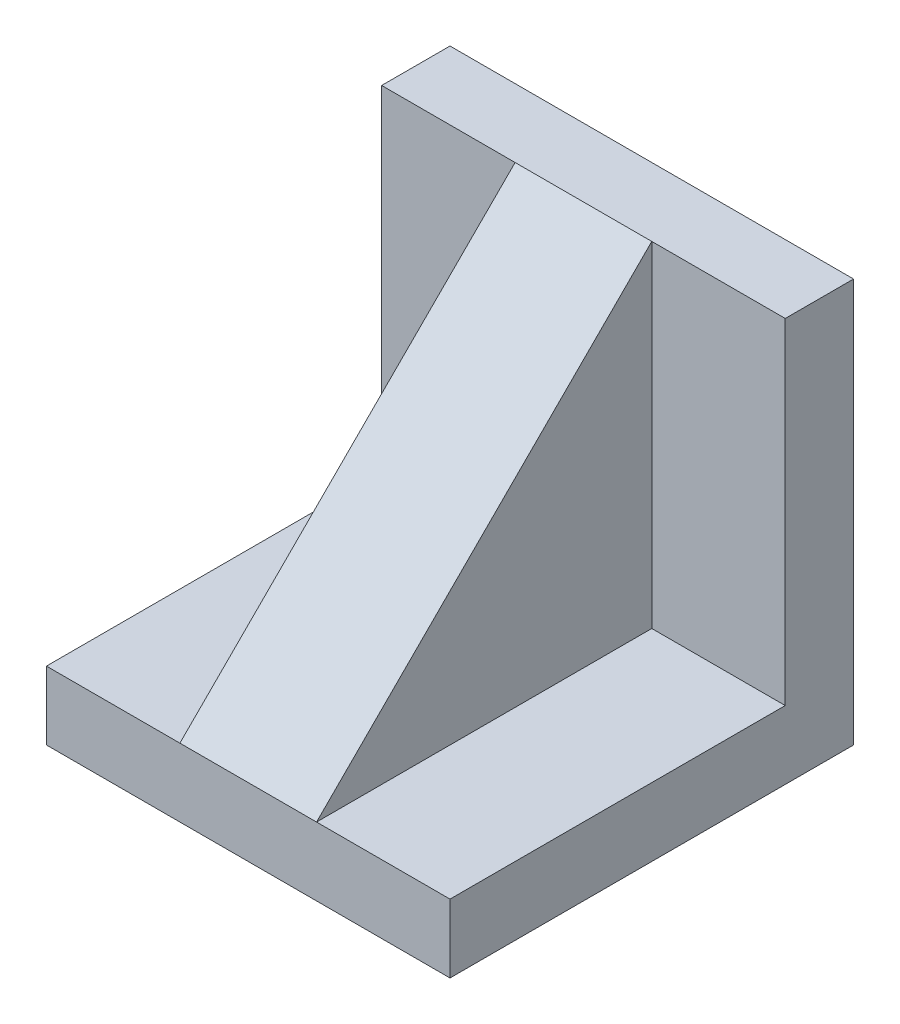
ISO-10303-21;
HEADER;
FILE_DESCRIPTION(('STEP AP214'),'2;1');
FILE_NAME('part.step','',(''),(''),'','','');
FILE_SCHEMA(('AUTOMOTIVE_DESIGN { 1 0 10303 214 1 1 1 1 }'));
ENDSEC;
DATA;
#1=APPLICATION_CONTEXT('core data for automotive mechanical design processes');
#2=APPLICATION_PROTOCOL_DEFINITION('international standard','automotive_design',2000,#1);
#3=PRODUCT_CONTEXT('',#1,'mechanical');
#4=PRODUCT('Part','Part','',(#3));
#5=PRODUCT_RELATED_PRODUCT_CATEGORY('part','',(#4));
#6=PRODUCT_DEFINITION_FORMATION('','',#4);
#7=PRODUCT_DEFINITION_CONTEXT('part definition',#1,'design');
#8=PRODUCT_DEFINITION('design','',#6,#7);
#9=PRODUCT_DEFINITION_SHAPE('','',#8);
#10=(LENGTH_UNIT() NAMED_UNIT(*) SI_UNIT(.MILLI.,.METRE.));
#11=(NAMED_UNIT(*) PLANE_ANGLE_UNIT() SI_UNIT($,.RADIAN.));
#12=(NAMED_UNIT(*) SI_UNIT($,.STERADIAN.) SOLID_ANGLE_UNIT());
#13=UNCERTAINTY_MEASURE_WITH_UNIT(LENGTH_MEASURE(1.E-05),#10,'distance_accuracy_value','');
#14=(GEOMETRIC_REPRESENTATION_CONTEXT(3) GLOBAL_UNCERTAINTY_ASSIGNED_CONTEXT((#13)) GLOBAL_UNIT_ASSIGNED_CONTEXT((#10,
#11,#12)) REPRESENTATION_CONTEXT('',''));
#15=CARTESIAN_POINT('',(0.,0.,0.));
#16=DIRECTION('',(0.,0.,1.));
#17=DIRECTION('',(1.,0.,0.));
#18=AXIS2_PLACEMENT_3D('',#15,#16,#17);
#19=CARTESIAN_POINT('',(-75.,25.4,150.));
#20=DIRECTION('',(0.,-1.,0.));
#21=DIRECTION('',(0.,0.,-1.));
#22=AXIS2_PLACEMENT_3D('',#19,#20,#21);
#23=PLANE('',#22);
#24=DIRECTION('',(0.,0.,-1.));
#25=VECTOR('',#24,1.);
#26=CARTESIAN_POINT('',(25.4,25.4,150.));
#27=LINE('',#26,#25);
#28=CARTESIAN_POINT('',(25.4,25.4,150.));
#29=VERTEX_POINT('',#28);
#30=CARTESIAN_POINT('',(25.4,25.4,25.4));
#31=VERTEX_POINT('',#30);
#32=EDGE_CURVE('E138',#29,#31,#27,.T.);
#33=ORIENTED_EDGE('',*,*,#32,.F.);
#34=DIRECTION('',(1.,0.,0.));
#35=VECTOR('',#34,1.);
#36=CARTESIAN_POINT('',(-75.,25.4,150.));
#37=LINE('',#36,#35);
#38=CARTESIAN_POINT('',(75.,25.4,150.));
#39=VERTEX_POINT('',#38);
#40=EDGE_CURVE('E60',#29,#39,#37,.T.);
#41=ORIENTED_EDGE('',*,*,#40,.T.);
#42=DIRECTION('',(0.,0.,-1.));
#43=VECTOR('',#42,1.);
#44=CARTESIAN_POINT('',(75.,25.4,150.));
#45=LINE('',#44,#43);
#46=CARTESIAN_POINT('',(75.,25.4,25.4));
#47=VERTEX_POINT('',#46);
#48=EDGE_CURVE('E211',#39,#47,#45,.T.);
#49=ORIENTED_EDGE('',*,*,#48,.T.);
#50=DIRECTION('',(1.,0.,0.));
#51=VECTOR('',#50,1.);
#52=CARTESIAN_POINT('',(-75.,25.4,25.4));
#53=LINE('',#52,#51);
#54=EDGE_CURVE('E147',#31,#47,#53,.T.);
#55=ORIENTED_EDGE('',*,*,#54,.F.);
#56=EDGE_LOOP('',(#33,#41,#49,#55));
#57=FACE_BOUND('',#56,.T.);
#58=ADVANCED_FACE('F51',(#57),#23,.F.);
#59=CARTESIAN_POINT('',(-75.,25.4,25.4));
#60=DIRECTION('',(0.,0.,-1.));
#61=DIRECTION('',(-1.,0.,0.));
#62=AXIS2_PLACEMENT_3D('',#59,#60,#61);
#63=PLANE('',#62);
#64=DIRECTION('',(0.,1.,0.));
#65=VECTOR('',#64,1.);
#66=CARTESIAN_POINT('',(25.4,25.4,25.4));
#67=LINE('',#66,#65);
#68=CARTESIAN_POINT('',(25.4,150.,25.4));
#69=VERTEX_POINT('',#68);
#70=EDGE_CURVE('E132',#31,#69,#67,.T.);
#71=ORIENTED_EDGE('',*,*,#70,.F.);
#72=ORIENTED_EDGE('',*,*,#54,.T.);
#73=DIRECTION('',(0.,1.,0.));
#74=VECTOR('',#73,1.);
#75=CARTESIAN_POINT('',(75.,25.4,25.4));
#76=LINE('',#75,#74);
#77=CARTESIAN_POINT('',(75.,150.,25.4));
#78=VERTEX_POINT('',#77);
#79=EDGE_CURVE('E207',#47,#78,#76,.T.);
#80=ORIENTED_EDGE('',*,*,#79,.T.);
#81=DIRECTION('',(1.,0.,0.));
#82=VECTOR('',#81,1.);
#83=CARTESIAN_POINT('',(-75.,150.,25.4));
#84=LINE('',#83,#82);
#85=EDGE_CURVE('E168',#69,#78,#84,.T.);
#86=ORIENTED_EDGE('',*,*,#85,.F.);
#87=EDGE_LOOP('',(#71,#72,#80,#86));
#88=FACE_BOUND('',#87,.T.);
#89=ADVANCED_FACE('F239',(#88),#63,.F.);
#90=CARTESIAN_POINT('',(-75.,0.,150.));
#91=DIRECTION('',(0.,0.,-1.));
#92=DIRECTION('',(-1.,0.,0.));
#93=AXIS2_PLACEMENT_3D('',#90,#91,#92);
#94=PLANE('',#93);
#95=DIRECTION('',(1.,0.,0.));
#96=VECTOR('',#95,1.);
#97=CARTESIAN_POINT('',(-75.,0.,150.));
#98=LINE('',#97,#96);
#99=CARTESIAN_POINT('',(-75.,0.,150.));
#100=VERTEX_POINT('',#99);
#101=CARTESIAN_POINT('',(75.,0.,150.));
#102=VERTEX_POINT('',#101);
#103=EDGE_CURVE('E175',#100,#102,#98,.T.);
#104=ORIENTED_EDGE('',*,*,#103,.T.);
#105=DIRECTION('',(0.,1.,0.));
#106=VECTOR('',#105,1.);
#107=CARTESIAN_POINT('',(75.,0.,150.));
#108=LINE('',#107,#106);
#109=EDGE_CURVE('E153',#102,#39,#108,.T.);
#110=ORIENTED_EDGE('',*,*,#109,.T.);
#111=ORIENTED_EDGE('',*,*,#40,.F.);
#112=DIRECTION('',(1.,0.,0.));
#113=VECTOR('',#112,1.);
#114=CARTESIAN_POINT('',(-25.4,25.4,150.));
#115=LINE('',#114,#113);
#116=CARTESIAN_POINT('',(-25.4,25.4,150.));
#117=VERTEX_POINT('',#116);
#118=EDGE_CURVE('E124',#117,#29,#115,.T.);
#119=ORIENTED_EDGE('',*,*,#118,.F.);
#120=CARTESIAN_POINT('',(-75.,25.4,150.));
#121=VERTEX_POINT('',#120);
#122=EDGE_CURVE('E11',#121,#117,#37,.T.);
#123=ORIENTED_EDGE('',*,*,#122,.F.);
#124=DIRECTION('',(0.,1.,0.));
#125=VECTOR('',#124,1.);
#126=CARTESIAN_POINT('',(-75.,0.,150.));
#127=LINE('',#126,#125);
#128=EDGE_CURVE('E192',#100,#121,#127,.T.);
#129=ORIENTED_EDGE('',*,*,#128,.F.);
#130=EDGE_LOOP('',(#104,#110,#111,#119,#123,#129));
#131=FACE_BOUND('',#130,.T.);
#132=ADVANCED_FACE('F53',(#131),#94,.F.);
#133=ORIENTED_EDGE('',*,*,#122,.T.);
#134=DIRECTION('',(0.,0.,-1.));
#135=VECTOR('',#134,1.);
#136=CARTESIAN_POINT('',(-25.4,25.4,150.));
#137=LINE('',#136,#135);
#138=CARTESIAN_POINT('',(-25.4,25.4,25.4));
#139=VERTEX_POINT('',#138);
#140=EDGE_CURVE('E216',#117,#139,#137,.T.);
#141=ORIENTED_EDGE('',*,*,#140,.T.);
#142=CARTESIAN_POINT('',(-75.,25.4,25.4));
#143=VERTEX_POINT('',#142);
#144=EDGE_CURVE('E155',#143,#139,#53,.T.);
#145=ORIENTED_EDGE('',*,*,#144,.F.);
#146=DIRECTION('',(0.,0.,-1.));
#147=VECTOR('',#146,1.);
#148=CARTESIAN_POINT('',(-75.,25.4,150.));
#149=LINE('',#148,#147);
#150=EDGE_CURVE('E189',#121,#143,#149,.T.);
#151=ORIENTED_EDGE('',*,*,#150,.F.);
#152=EDGE_LOOP('',(#133,#141,#145,#151));
#153=FACE_BOUND('',#152,.T.);
#154=ADVANCED_FACE('F247',(#153),#23,.F.);
#155=ORIENTED_EDGE('',*,*,#144,.T.);
#156=DIRECTION('',(0.,1.,0.));
#157=VECTOR('',#156,1.);
#158=CARTESIAN_POINT('',(-25.4,25.4,25.4));
#159=LINE('',#158,#157);
#160=CARTESIAN_POINT('',(-25.4,150.,25.4));
#161=VERTEX_POINT('',#160);
#162=EDGE_CURVE('E149',#139,#161,#159,.T.);
#163=ORIENTED_EDGE('',*,*,#162,.T.);
#164=CARTESIAN_POINT('',(-75.,150.,25.4));
#165=VERTEX_POINT('',#164);
#166=EDGE_CURVE('E163',#165,#161,#84,.T.);
#167=ORIENTED_EDGE('',*,*,#166,.F.);
#168=DIRECTION('',(0.,1.,0.));
#169=VECTOR('',#168,1.);
#170=CARTESIAN_POINT('',(-75.,25.4,25.4));
#171=LINE('',#170,#169);
#172=EDGE_CURVE('E186',#143,#165,#171,.T.);
#173=ORIENTED_EDGE('',*,*,#172,.F.);
#174=EDGE_LOOP('',(#155,#163,#167,#173));
#175=FACE_BOUND('',#174,.T.);
#176=ADVANCED_FACE('F242',(#175),#63,.F.);
#177=CARTESIAN_POINT('',(-75.,150.,25.4));
#178=DIRECTION('',(0.,-1.,0.));
#179=DIRECTION('',(0.,0.,-1.));
#180=AXIS2_PLACEMENT_3D('',#177,#178,#179);
#181=PLANE('',#180);
#182=ORIENTED_EDGE('',*,*,#166,.T.);
#183=DIRECTION('',(1.,0.,0.));
#184=VECTOR('',#183,1.);
#185=CARTESIAN_POINT('',(-25.4,150.,25.4));
#186=LINE('',#185,#184);
#187=EDGE_CURVE('E133',#161,#69,#186,.T.);
#188=ORIENTED_EDGE('',*,*,#187,.T.);
#189=ORIENTED_EDGE('',*,*,#85,.T.);
#190=DIRECTION('',(0.,0.,-1.));
#191=VECTOR('',#190,1.);
#192=CARTESIAN_POINT('',(75.,150.,25.4));
#193=LINE('',#192,#191);
#194=CARTESIAN_POINT('',(75.,150.,0.));
#195=VERTEX_POINT('',#194);
#196=EDGE_CURVE('E203',#78,#195,#193,.T.);
#197=ORIENTED_EDGE('',*,*,#196,.T.);
#198=DIRECTION('',(1.,0.,0.));
#199=VECTOR('',#198,1.);
#200=CARTESIAN_POINT('',(-75.,150.,0.));
#201=LINE('',#200,#199);
#202=CARTESIAN_POINT('',(-75.,150.,0.));
#203=VERTEX_POINT('',#202);
#204=EDGE_CURVE('E169',#203,#195,#201,.T.);
#205=ORIENTED_EDGE('',*,*,#204,.F.);
#206=DIRECTION('',(0.,0.,-1.));
#207=VECTOR('',#206,1.);
#208=CARTESIAN_POINT('',(-75.,150.,25.4));
#209=LINE('',#208,#207);
#210=EDGE_CURVE('E183',#165,#203,#209,.T.);
#211=ORIENTED_EDGE('',*,*,#210,.F.);
#212=EDGE_LOOP('',(#182,#188,#189,#197,#205,#211));
#213=FACE_BOUND('',#212,.T.);
#214=ADVANCED_FACE('F231',(#213),#181,.F.);
#215=CARTESIAN_POINT('',(-75.,150.,0.));
#216=DIRECTION('',(0.,0.,1.));
#217=DIRECTION('',(0.,-1.,0.));
#218=AXIS2_PLACEMENT_3D('',#215,#216,#217);
#219=PLANE('',#218);
#220=ORIENTED_EDGE('',*,*,#204,.T.);
#221=DIRECTION('',(0.,-1.,0.));
#222=VECTOR('',#221,1.);
#223=CARTESIAN_POINT('',(75.,150.,0.));
#224=LINE('',#223,#222);
#225=CARTESIAN_POINT('',(75.,0.,0.));
#226=VERTEX_POINT('',#225);
#227=EDGE_CURVE('E199',#195,#226,#224,.T.);
#228=ORIENTED_EDGE('',*,*,#227,.T.);
#229=DIRECTION('',(1.,0.,0.));
#230=VECTOR('',#229,1.);
#231=CARTESIAN_POINT('',(-75.,0.,0.));
#232=LINE('',#231,#230);
#233=CARTESIAN_POINT('',(-75.,0.,0.));
#234=VERTEX_POINT('',#233);
#235=EDGE_CURVE('E172',#234,#226,#232,.T.);
#236=ORIENTED_EDGE('',*,*,#235,.F.);
#237=DIRECTION('',(0.,-1.,0.));
#238=VECTOR('',#237,1.);
#239=CARTESIAN_POINT('',(-75.,150.,0.));
#240=LINE('',#239,#238);
#241=EDGE_CURVE('E180',#203,#234,#240,.T.);
#242=ORIENTED_EDGE('',*,*,#241,.F.);
#243=EDGE_LOOP('',(#220,#228,#236,#242));
#244=FACE_BOUND('',#243,.T.);
#245=ADVANCED_FACE('F254',(#244),#219,.F.);
#246=CARTESIAN_POINT('',(-75.,0.,0.));
#247=DIRECTION('',(0.,1.,0.));
#248=DIRECTION('',(0.,0.,1.));
#249=AXIS2_PLACEMENT_3D('',#246,#247,#248);
#250=PLANE('',#249);
#251=ORIENTED_EDGE('',*,*,#235,.T.);
#252=DIRECTION('',(0.,0.,1.));
#253=VECTOR('',#252,1.);
#254=CARTESIAN_POINT('',(75.,0.,0.));
#255=LINE('',#254,#253);
#256=EDGE_CURVE('E195',#226,#102,#255,.T.);
#257=ORIENTED_EDGE('',*,*,#256,.T.);
#258=ORIENTED_EDGE('',*,*,#103,.F.);
#259=DIRECTION('',(0.,0.,1.));
#260=VECTOR('',#259,1.);
#261=CARTESIAN_POINT('',(-75.,0.,0.));
#262=LINE('',#261,#260);
#263=EDGE_CURVE('E75',#234,#100,#262,.T.);
#264=ORIENTED_EDGE('',*,*,#263,.F.);
#265=EDGE_LOOP('',(#251,#257,#258,#264));
#266=FACE_BOUND('',#265,.T.);
#267=ADVANCED_FACE('F267',(#266),#250,.F.);
#268=CARTESIAN_POINT('',(-75.,0.,0.));
#269=DIRECTION('',(-1.,0.,0.));
#270=DIRECTION('',(0.,0.,1.));
#271=AXIS2_PLACEMENT_3D('',#268,#269,#270);
#272=PLANE('',#271);
#273=ORIENTED_EDGE('',*,*,#128,.T.);
#274=ORIENTED_EDGE('',*,*,#150,.T.);
#275=ORIENTED_EDGE('',*,*,#172,.T.);
#276=ORIENTED_EDGE('',*,*,#210,.T.);
#277=ORIENTED_EDGE('',*,*,#241,.T.);
#278=ORIENTED_EDGE('',*,*,#263,.T.);
#279=EDGE_LOOP('',(#273,#274,#275,#276,#277,#278));
#280=FACE_BOUND('',#279,.T.);
#281=ADVANCED_FACE('F260',(#280),#272,.T.);
#282=CARTESIAN_POINT('',(75.,0.,0.));
#283=DIRECTION('',(-1.,0.,0.));
#284=DIRECTION('',(0.,0.,1.));
#285=AXIS2_PLACEMENT_3D('',#282,#283,#284);
#286=PLANE('',#285);
#287=ORIENTED_EDGE('',*,*,#109,.F.);
#288=ORIENTED_EDGE('',*,*,#256,.F.);
#289=ORIENTED_EDGE('',*,*,#227,.F.);
#290=ORIENTED_EDGE('',*,*,#196,.F.);
#291=ORIENTED_EDGE('',*,*,#79,.F.);
#292=ORIENTED_EDGE('',*,*,#48,.F.);
#293=EDGE_LOOP('',(#287,#288,#289,#290,#291,#292));
#294=FACE_BOUND('',#293,.T.);
#295=ADVANCED_FACE('F237',(#294),#286,.F.);
#296=CARTESIAN_POINT('',(-25.4,0.,0.));
#297=DIRECTION('',(-1.,0.,0.));
#298=DIRECTION('',(0.,0.,1.));
#299=AXIS2_PLACEMENT_3D('',#296,#297,#298);
#300=PLANE('',#299);
#301=ORIENTED_EDGE('',*,*,#140,.F.);
#302=DIRECTION('',(0.,-0.707106781186547,0.707106781186547));
#303=VECTOR('',#302,1.);
#304=CARTESIAN_POINT('',(-25.4,25.4,150.));
#305=LINE('',#304,#303);
#306=EDGE_CURVE('E127',#161,#117,#305,.T.);
#307=ORIENTED_EDGE('',*,*,#306,.F.);
#308=ORIENTED_EDGE('',*,*,#162,.F.);
#309=EDGE_LOOP('',(#301,#307,#308));
#310=FACE_BOUND('',#309,.T.);
#311=ADVANCED_FACE('F277',(#310),#300,.T.);
#312=CARTESIAN_POINT('',(25.4,0.,0.));
#313=DIRECTION('',(-1.,0.,0.));
#314=DIRECTION('',(0.,0.,1.));
#315=AXIS2_PLACEMENT_3D('',#312,#313,#314);
#316=PLANE('',#315);
#317=DIRECTION('',(0.,-0.707106781186547,0.707106781186547));
#318=VECTOR('',#317,1.);
#319=CARTESIAN_POINT('',(25.4,25.4,150.));
#320=LINE('',#319,#318);
#321=EDGE_CURVE('E67',#69,#29,#320,.T.);
#322=ORIENTED_EDGE('',*,*,#321,.T.);
#323=ORIENTED_EDGE('',*,*,#32,.T.);
#324=ORIENTED_EDGE('',*,*,#70,.T.);
#325=EDGE_LOOP('',(#322,#323,#324));
#326=FACE_BOUND('',#325,.T.);
#327=ADVANCED_FACE('F137',(#326),#316,.F.);
#328=CARTESIAN_POINT('',(-25.4,25.4,150.));
#329=DIRECTION('',(0.,0.707106781186548,0.707106781186548));
#330=DIRECTION('',(0.,-0.707106781186548,0.707106781186548));
#331=AXIS2_PLACEMENT_3D('',#328,#329,#330);
#332=PLANE('',#331);
#333=ORIENTED_EDGE('',*,*,#118,.T.);
#334=ORIENTED_EDGE('',*,*,#321,.F.);
#335=ORIENTED_EDGE('',*,*,#187,.F.);
#336=ORIENTED_EDGE('',*,*,#306,.T.);
#337=EDGE_LOOP('',(#333,#334,#335,#336));
#338=FACE_BOUND('',#337,.T.);
#339=ADVANCED_FACE('F125',(#338),#332,.T.);
#340=CLOSED_SHELL('',(#58,#89,#132,#154,#176,#214,#245,#267,#281,#295,#311,#327,#339));
#341=MANIFOLD_SOLID_BREP('B2',#340);
#342=ADVANCED_BREP_SHAPE_REPRESENTATION('',(#18,#341),#14);
#343=SHAPE_DEFINITION_REPRESENTATION(#9,#342);
ENDSEC;
END-ISO-10303-21;
